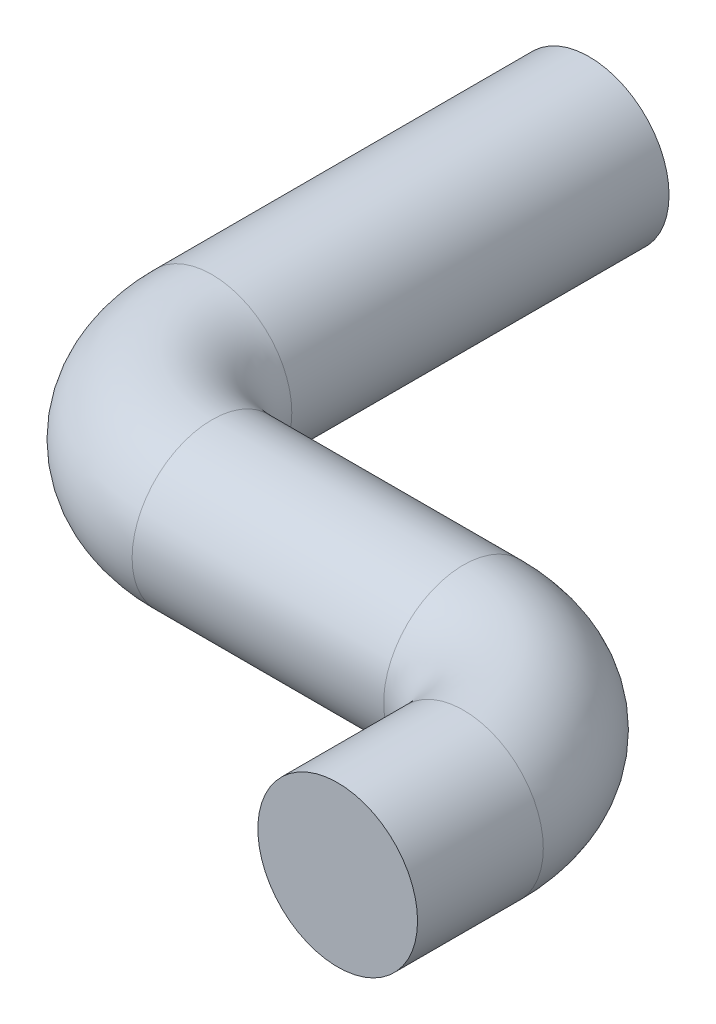
ISO-10303-21;
HEADER;
FILE_DESCRIPTION(('STEP AP214'),'2;1');
FILE_NAME('part.step','',(''),(''),'','','');
FILE_SCHEMA(('AUTOMOTIVE_DESIGN { 1 0 10303 214 1 1 1 1 }'));
ENDSEC;
DATA;
#1=APPLICATION_CONTEXT('core data for automotive mechanical design processes');
#2=APPLICATION_PROTOCOL_DEFINITION('international standard','automotive_design',2000,#1);
#3=PRODUCT_CONTEXT('',#1,'mechanical');
#4=PRODUCT('Part','Part','',(#3));
#5=PRODUCT_RELATED_PRODUCT_CATEGORY('part','',(#4));
#6=PRODUCT_DEFINITION_FORMATION('','',#4);
#7=PRODUCT_DEFINITION_CONTEXT('part definition',#1,'design');
#8=PRODUCT_DEFINITION('design','',#6,#7);
#9=PRODUCT_DEFINITION_SHAPE('','',#8);
#10=(LENGTH_UNIT() NAMED_UNIT(*) SI_UNIT(.MILLI.,.METRE.));
#11=(NAMED_UNIT(*) PLANE_ANGLE_UNIT() SI_UNIT($,.RADIAN.));
#12=(NAMED_UNIT(*) SI_UNIT($,.STERADIAN.) SOLID_ANGLE_UNIT());
#13=UNCERTAINTY_MEASURE_WITH_UNIT(LENGTH_MEASURE(1.E-05),#10,'distance_accuracy_value','');
#14=(GEOMETRIC_REPRESENTATION_CONTEXT(3) GLOBAL_UNCERTAINTY_ASSIGNED_CONTEXT((#13)) GLOBAL_UNIT_ASSIGNED_CONTEXT((#10,
#11,#12)) REPRESENTATION_CONTEXT('',''));
#15=CARTESIAN_POINT('',(0.,0.,0.));
#16=DIRECTION('',(0.,0.,1.));
#17=DIRECTION('',(1.,0.,0.));
#18=AXIS2_PLACEMENT_3D('',#15,#16,#17);
#19=CARTESIAN_POINT('',(0.,0.,0.));
#20=DIRECTION('',(0.,0.,1.));
#21=DIRECTION('',(1.,0.,0.));
#22=AXIS2_PLACEMENT_3D('',#19,#20,#21);
#23=PLANE('',#22);
#24=CARTESIAN_POINT('',(0.,0.,0.));
#25=DIRECTION('',(0.,0.,1.));
#26=DIRECTION('',(1.,0.,0.));
#27=AXIS2_PLACEMENT_3D('',#24,#25,#26);
#28=CIRCLE('',#27,6.35);
#29=CARTESIAN_POINT('',(6.35,0.,0.));
#30=VERTEX_POINT('',#29);
#31=EDGE_CURVE('E44',#30,#30,#28,.T.);
#32=ORIENTED_EDGE('',*,*,#31,.F.);
#33=EDGE_LOOP('',(#32));
#34=FACE_BOUND('',#33,.T.);
#35=ADVANCED_FACE('F32',(#34),#23,.F.);
#36=CARTESIAN_POINT('',(40.,0.,60.));
#37=DIRECTION('',(0.,0.,1.));
#38=DIRECTION('',(1.,0.,0.));
#39=AXIS2_PLACEMENT_3D('',#36,#37,#38);
#40=PLANE('',#39);
#41=CARTESIAN_POINT('',(40.,0.,60.));
#42=DIRECTION('',(0.,0.,1.));
#43=DIRECTION('',(1.,0.,0.));
#44=AXIS2_PLACEMENT_3D('',#41,#42,#43);
#45=CIRCLE('',#44,6.35);
#46=CARTESIAN_POINT('',(46.35,0.,60.));
#47=VERTEX_POINT('',#46);
#48=EDGE_CURVE('E11',#47,#47,#45,.T.);
#49=ORIENTED_EDGE('',*,*,#48,.T.);
#50=EDGE_LOOP('',(#49));
#51=FACE_BOUND('',#50,.T.);
#52=ADVANCED_FACE('F47',(#51),#40,.T.);
#53=CARTESIAN_POINT('',(0.,0.,0.));
#54=DIRECTION('',(0.,0.,1.));
#55=DIRECTION('',(1.,0.,0.));
#56=AXIS2_PLACEMENT_3D('',#53,#54,#55);
#57=CYLINDRICAL_SURFACE('',#56,6.35);
#58=CARTESIAN_POINT('',(0.,0.,30.));
#59=DIRECTION('',(0.,0.,1.));
#60=DIRECTION('',(1.,0.,0.));
#61=AXIS2_PLACEMENT_3D('',#58,#59,#60);
#62=CIRCLE('',#61,6.35);
#63=CARTESIAN_POINT('',(-6.35,0.,30.));
#64=VERTEX_POINT('',#63);
#65=EDGE_CURVE('E64',#64,#64,#62,.T.);
#66=ORIENTED_EDGE('',*,*,#65,.F.);
#67=EDGE_LOOP('',(#66));
#68=FACE_BOUND('',#67,.T.);
#69=ORIENTED_EDGE('',*,*,#31,.T.);
#70=EDGE_LOOP('',(#69));
#71=FACE_BOUND('',#70,.T.);
#72=ADVANCED_FACE('F68',(#68,#71),#57,.T.);
#73=CARTESIAN_POINT('',(10.,0.,30.));
#74=DIRECTION('',(0.,1.,0.));
#75=DIRECTION('',(0.,0.,1.));
#76=AXIS2_PLACEMENT_3D('',#73,#74,#75);
#77=TOROIDAL_SURFACE('',#76,10.,6.35);
#78=CARTESIAN_POINT('',(10.,0.,40.));
#79=DIRECTION('',(1.,0.,0.));
#80=DIRECTION('',(0.,0.,-1.));
#81=AXIS2_PLACEMENT_3D('',#78,#79,#80);
#82=CIRCLE('',#81,6.35);
#83=CARTESIAN_POINT('',(10.,0.,46.35));
#84=VERTEX_POINT('',#83);
#85=EDGE_CURVE('E59',#84,#84,#82,.T.);
#86=CARTESIAN_POINT('',(10.,0.,30.));
#87=DIRECTION('',(0.,1.,0.));
#88=DIRECTION('',(0.,0.,1.));
#89=AXIS2_PLACEMENT_3D('',#86,#87,#88);
#90=CIRCLE('',#89,16.35);
#91=EDGE_CURVE('',#64,#84,#90,.T.);
#92=ORIENTED_EDGE('',*,*,#65,.T.);
#93=ORIENTED_EDGE('',*,*,#85,.F.);
#94=ORIENTED_EDGE('',*,*,#91,.T.);
#95=ORIENTED_EDGE('',*,*,#91,.F.);
#96=EDGE_LOOP('',(#92,#94,#93,#95));
#97=FACE_BOUND('',#96,.T.);
#98=ADVANCED_FACE('F70',(#97),#77,.T.);
#99=CARTESIAN_POINT('',(10.,0.,40.));
#100=DIRECTION('',(1.,0.,0.));
#101=DIRECTION('',(0.,0.,-1.));
#102=AXIS2_PLACEMENT_3D('',#99,#100,#101);
#103=CYLINDRICAL_SURFACE('',#102,6.35);
#104=CARTESIAN_POINT('',(30.,0.,40.));
#105=DIRECTION('',(1.,0.,0.));
#106=DIRECTION('',(0.,0.,-1.));
#107=AXIS2_PLACEMENT_3D('',#104,#105,#106);
#108=CIRCLE('',#107,6.35);
#109=CARTESIAN_POINT('',(30.,0.,33.65));
#110=VERTEX_POINT('',#109);
#111=EDGE_CURVE('E57',#110,#110,#108,.T.);
#112=ORIENTED_EDGE('',*,*,#111,.F.);
#113=EDGE_LOOP('',(#112));
#114=FACE_BOUND('',#113,.T.);
#115=ORIENTED_EDGE('',*,*,#85,.T.);
#116=EDGE_LOOP('',(#115));
#117=FACE_BOUND('',#116,.T.);
#118=ADVANCED_FACE('F77',(#114,#117),#103,.T.);
#119=CARTESIAN_POINT('',(30.,0.,50.));
#120=DIRECTION('',(0.,-1.,0.));
#121=DIRECTION('',(0.,0.,-1.));
#122=AXIS2_PLACEMENT_3D('',#119,#120,#121);
#123=TOROIDAL_SURFACE('',#122,10.,6.35);
#124=CARTESIAN_POINT('',(40.,0.,50.));
#125=DIRECTION('',(0.,0.,1.));
#126=DIRECTION('',(1.,0.,0.));
#127=AXIS2_PLACEMENT_3D('',#124,#125,#126);
#128=CIRCLE('',#127,6.35);
#129=CARTESIAN_POINT('',(46.35,0.,50.));
#130=VERTEX_POINT('',#129);
#131=EDGE_CURVE('E39',#130,#130,#128,.T.);
#132=CARTESIAN_POINT('',(30.,0.,50.));
#133=DIRECTION('',(0.,-1.,0.));
#134=DIRECTION('',(0.,0.,-1.));
#135=AXIS2_PLACEMENT_3D('',#132,#133,#134);
#136=CIRCLE('',#135,16.35);
#137=EDGE_CURVE('',#110,#130,#136,.T.);
#138=ORIENTED_EDGE('',*,*,#111,.T.);
#139=ORIENTED_EDGE('',*,*,#131,.F.);
#140=ORIENTED_EDGE('',*,*,#137,.T.);
#141=ORIENTED_EDGE('',*,*,#137,.F.);
#142=EDGE_LOOP('',(#138,#140,#139,#141));
#143=FACE_BOUND('',#142,.T.);
#144=ADVANCED_FACE('F52',(#143),#123,.T.);
#145=CARTESIAN_POINT('',(40.,0.,50.));
#146=DIRECTION('',(0.,0.,1.));
#147=DIRECTION('',(1.,0.,0.));
#148=AXIS2_PLACEMENT_3D('',#145,#146,#147);
#149=CYLINDRICAL_SURFACE('',#148,6.35);
#150=ORIENTED_EDGE('',*,*,#48,.F.);
#151=EDGE_LOOP('',(#150));
#152=FACE_BOUND('',#151,.T.);
#153=ORIENTED_EDGE('',*,*,#131,.T.);
#154=EDGE_LOOP('',(#153));
#155=FACE_BOUND('',#154,.T.);
#156=ADVANCED_FACE('F49',(#152,#155),#149,.T.);
#157=CLOSED_SHELL('',(#35,#52,#72,#98,#118,#144,#156));
#158=MANIFOLD_SOLID_BREP('B2',#157);
#159=ADVANCED_BREP_SHAPE_REPRESENTATION('',(#18,#158),#14);
#160=SHAPE_DEFINITION_REPRESENTATION(#9,#159);
ENDSEC;
END-ISO-10303-21;
